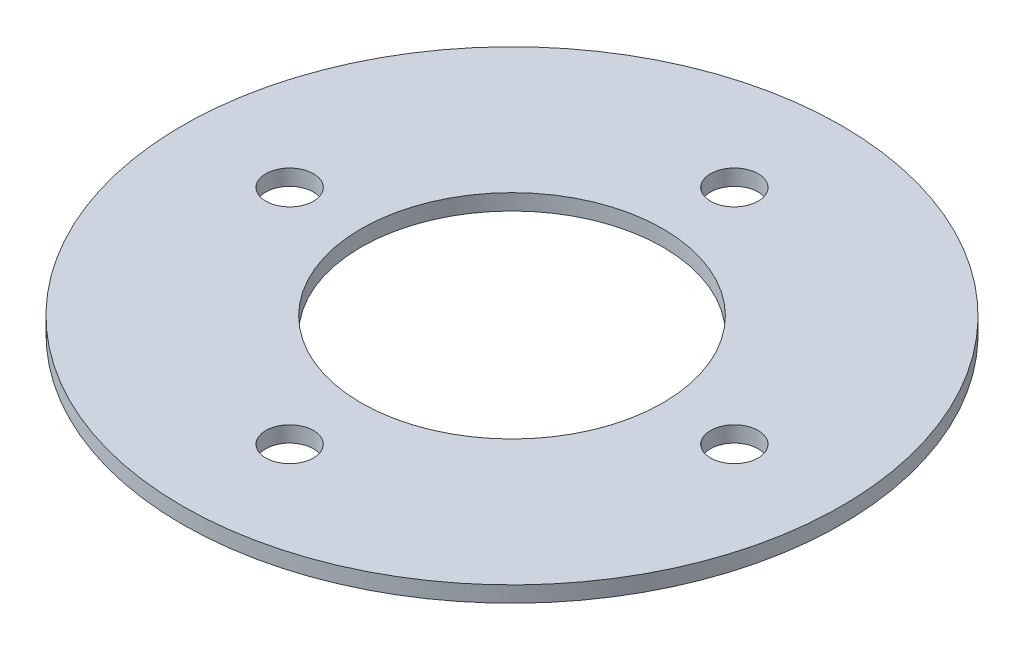
ISO-10303-21;
HEADER;
FILE_DESCRIPTION(('STEP AP214'),'2;1');
FILE_NAME('part.step','',(''),(''),'','','');
FILE_SCHEMA(('AUTOMOTIVE_DESIGN { 1 0 10303 214 1 1 1 1 }'));
ENDSEC;
DATA;
#1=APPLICATION_CONTEXT('core data for automotive mechanical design processes');
#2=APPLICATION_PROTOCOL_DEFINITION('international standard','automotive_design',2000,#1);
#3=PRODUCT_CONTEXT('',#1,'mechanical');
#4=PRODUCT('Part','Part','',(#3));
#5=PRODUCT_RELATED_PRODUCT_CATEGORY('part','',(#4));
#6=PRODUCT_DEFINITION_FORMATION('','',#4);
#7=PRODUCT_DEFINITION_CONTEXT('part definition',#1,'design');
#8=PRODUCT_DEFINITION('design','',#6,#7);
#9=PRODUCT_DEFINITION_SHAPE('','',#8);
#10=(LENGTH_UNIT() NAMED_UNIT(*) SI_UNIT(.MILLI.,.METRE.));
#11=(NAMED_UNIT(*) PLANE_ANGLE_UNIT() SI_UNIT($,.RADIAN.));
#12=(NAMED_UNIT(*) SI_UNIT($,.STERADIAN.) SOLID_ANGLE_UNIT());
#13=UNCERTAINTY_MEASURE_WITH_UNIT(LENGTH_MEASURE(1.E-05),#10,'distance_accuracy_value','');
#14=(GEOMETRIC_REPRESENTATION_CONTEXT(3) GLOBAL_UNCERTAINTY_ASSIGNED_CONTEXT((#13)) GLOBAL_UNIT_ASSIGNED_CONTEXT((#10,
#11,#12)) REPRESENTATION_CONTEXT('',''));
#15=CARTESIAN_POINT('',(0.,0.,0.));
#16=DIRECTION('',(0.,0.,1.));
#17=DIRECTION('',(1.,0.,0.));
#18=AXIS2_PLACEMENT_3D('',#15,#16,#17);
#19=CARTESIAN_POINT('',(0.,1.,0.));
#20=DIRECTION('',(0.,-1.,0.));
#21=DIRECTION('',(0.,0.,-1.));
#22=AXIS2_PLACEMENT_3D('',#19,#20,#21);
#23=CYLINDRICAL_SURFACE('',#22,9.5);
#24=CARTESIAN_POINT('',(0.,1.,0.));
#25=DIRECTION('',(0.,1.,0.));
#26=DIRECTION('',(0.,0.,1.));
#27=AXIS2_PLACEMENT_3D('',#24,#25,#26);
#28=CIRCLE('',#27,9.5);
#29=CARTESIAN_POINT('',(0.,1.,9.5));
#30=VERTEX_POINT('',#29);
#31=EDGE_CURVE('E47',#30,#30,#28,.T.);
#32=ORIENTED_EDGE('',*,*,#31,.T.);
#33=EDGE_LOOP('',(#32));
#34=FACE_BOUND('',#33,.T.);
#35=CARTESIAN_POINT('',(0.,0.,0.));
#36=DIRECTION('',(0.,1.,0.));
#37=DIRECTION('',(0.,0.,1.));
#38=AXIS2_PLACEMENT_3D('',#35,#36,#37);
#39=CIRCLE('',#38,9.5);
#40=CARTESIAN_POINT('',(0.,0.,9.5));
#41=VERTEX_POINT('',#40);
#42=EDGE_CURVE('E66',#41,#41,#39,.T.);
#43=ORIENTED_EDGE('',*,*,#42,.F.);
#44=EDGE_LOOP('',(#43));
#45=FACE_BOUND('',#44,.T.);
#46=ADVANCED_FACE('F41',(#34,#45),#23,.F.);
#47=CARTESIAN_POINT('',(14.,1.,0.));
#48=DIRECTION('',(0.,-1.,0.));
#49=DIRECTION('',(0.,0.,-1.));
#50=AXIS2_PLACEMENT_3D('',#47,#48,#49);
#51=CYLINDRICAL_SURFACE('',#50,1.5);
#52=CARTESIAN_POINT('',(14.,1.,0.));
#53=DIRECTION('',(0.,1.,0.));
#54=DIRECTION('',(0.,0.,1.));
#55=AXIS2_PLACEMENT_3D('',#52,#53,#54);
#56=CIRCLE('',#55,1.5);
#57=CARTESIAN_POINT('',(14.,1.,1.5));
#58=VERTEX_POINT('',#57);
#59=EDGE_CURVE('E53',#58,#58,#56,.T.);
#60=ORIENTED_EDGE('',*,*,#59,.T.);
#61=EDGE_LOOP('',(#60));
#62=FACE_BOUND('',#61,.T.);
#63=CARTESIAN_POINT('',(14.,0.,0.));
#64=DIRECTION('',(0.,1.,0.));
#65=DIRECTION('',(0.,0.,1.));
#66=AXIS2_PLACEMENT_3D('',#63,#64,#65);
#67=CIRCLE('',#66,1.5);
#68=CARTESIAN_POINT('',(14.,0.,1.5));
#69=VERTEX_POINT('',#68);
#70=EDGE_CURVE('E69',#69,#69,#67,.T.);
#71=ORIENTED_EDGE('',*,*,#70,.F.);
#72=EDGE_LOOP('',(#71));
#73=FACE_BOUND('',#72,.T.);
#74=ADVANCED_FACE('F89',(#62,#73),#51,.F.);
#75=CARTESIAN_POINT('',(0.,1.,14.));
#76=DIRECTION('',(0.,-1.,0.));
#77=DIRECTION('',(0.,0.,-1.));
#78=AXIS2_PLACEMENT_3D('',#75,#76,#77);
#79=CYLINDRICAL_SURFACE('',#78,1.5);
#80=CARTESIAN_POINT('',(0.,1.,14.));
#81=DIRECTION('',(0.,1.,0.));
#82=DIRECTION('',(0.,0.,1.));
#83=AXIS2_PLACEMENT_3D('',#80,#81,#82);
#84=CIRCLE('',#83,1.5);
#85=CARTESIAN_POINT('',(0.,1.,15.5));
#86=VERTEX_POINT('',#85);
#87=EDGE_CURVE('E85',#86,#86,#84,.T.);
#88=ORIENTED_EDGE('',*,*,#87,.T.);
#89=EDGE_LOOP('',(#88));
#90=FACE_BOUND('',#89,.T.);
#91=CARTESIAN_POINT('',(0.,0.,14.));
#92=DIRECTION('',(0.,1.,0.));
#93=DIRECTION('',(0.,0.,1.));
#94=AXIS2_PLACEMENT_3D('',#91,#92,#93);
#95=CIRCLE('',#94,1.5);
#96=CARTESIAN_POINT('',(0.,0.,15.5));
#97=VERTEX_POINT('',#96);
#98=EDGE_CURVE('E65',#97,#97,#95,.T.);
#99=ORIENTED_EDGE('',*,*,#98,.F.);
#100=EDGE_LOOP('',(#99));
#101=FACE_BOUND('',#100,.T.);
#102=ADVANCED_FACE('F107',(#90,#101),#79,.F.);
#103=CARTESIAN_POINT('',(-14.,1.,0.));
#104=DIRECTION('',(0.,-1.,0.));
#105=DIRECTION('',(0.,0.,-1.));
#106=AXIS2_PLACEMENT_3D('',#103,#104,#105);
#107=CYLINDRICAL_SURFACE('',#106,1.5);
#108=CARTESIAN_POINT('',(-14.,1.,0.));
#109=DIRECTION('',(0.,1.,0.));
#110=DIRECTION('',(0.,0.,1.));
#111=AXIS2_PLACEMENT_3D('',#108,#109,#110);
#112=CIRCLE('',#111,1.5);
#113=CARTESIAN_POINT('',(-14.,1.,1.5));
#114=VERTEX_POINT('',#113);
#115=EDGE_CURVE('E77',#114,#114,#112,.T.);
#116=ORIENTED_EDGE('',*,*,#115,.T.);
#117=EDGE_LOOP('',(#116));
#118=FACE_BOUND('',#117,.T.);
#119=CARTESIAN_POINT('',(-14.,0.,0.));
#120=DIRECTION('',(0.,1.,0.));
#121=DIRECTION('',(0.,0.,1.));
#122=AXIS2_PLACEMENT_3D('',#119,#120,#121);
#123=CIRCLE('',#122,1.5);
#124=CARTESIAN_POINT('',(-14.,0.,1.5));
#125=VERTEX_POINT('',#124);
#126=EDGE_CURVE('E63',#125,#125,#123,.T.);
#127=ORIENTED_EDGE('',*,*,#126,.F.);
#128=EDGE_LOOP('',(#127));
#129=FACE_BOUND('',#128,.T.);
#130=ADVANCED_FACE('F111',(#118,#129),#107,.F.);
#131=CARTESIAN_POINT('',(0.,1.,-14.));
#132=DIRECTION('',(0.,-1.,0.));
#133=DIRECTION('',(0.,0.,-1.));
#134=AXIS2_PLACEMENT_3D('',#131,#132,#133);
#135=CYLINDRICAL_SURFACE('',#134,1.5);
#136=CARTESIAN_POINT('',(0.,1.,-14.));
#137=DIRECTION('',(0.,1.,0.));
#138=DIRECTION('',(0.,0.,1.));
#139=AXIS2_PLACEMENT_3D('',#136,#137,#138);
#140=CIRCLE('',#139,1.5);
#141=CARTESIAN_POINT('',(0.,1.,-12.5));
#142=VERTEX_POINT('',#141);
#143=EDGE_CURVE('E74',#142,#142,#140,.T.);
#144=ORIENTED_EDGE('',*,*,#143,.T.);
#145=EDGE_LOOP('',(#144));
#146=FACE_BOUND('',#145,.T.);
#147=CARTESIAN_POINT('',(0.,0.,-14.));
#148=DIRECTION('',(0.,1.,0.));
#149=DIRECTION('',(0.,0.,1.));
#150=AXIS2_PLACEMENT_3D('',#147,#148,#149);
#151=CIRCLE('',#150,1.5);
#152=CARTESIAN_POINT('',(0.,0.,-12.5));
#153=VERTEX_POINT('',#152);
#154=EDGE_CURVE('E59',#153,#153,#151,.T.);
#155=ORIENTED_EDGE('',*,*,#154,.F.);
#156=EDGE_LOOP('',(#155));
#157=FACE_BOUND('',#156,.T.);
#158=ADVANCED_FACE('F43',(#146,#157),#135,.F.);
#159=CARTESIAN_POINT('',(0.,1.,0.));
#160=DIRECTION('',(0.,-1.,0.));
#161=DIRECTION('',(0.,0.,-1.));
#162=AXIS2_PLACEMENT_3D('',#159,#160,#161);
#163=CYLINDRICAL_SURFACE('',#162,20.75);
#164=CARTESIAN_POINT('',(0.,1.,0.));
#165=DIRECTION('',(0.,1.,0.));
#166=DIRECTION('',(0.,0.,1.));
#167=AXIS2_PLACEMENT_3D('',#164,#165,#166);
#168=CIRCLE('',#167,20.75);
#169=CARTESIAN_POINT('',(0.,1.,20.75));
#170=VERTEX_POINT('',#169);
#171=EDGE_CURVE('E10',#170,#170,#168,.T.);
#172=ORIENTED_EDGE('',*,*,#171,.F.);
#173=EDGE_LOOP('',(#172));
#174=FACE_BOUND('',#173,.T.);
#175=CARTESIAN_POINT('',(0.,0.,0.));
#176=DIRECTION('',(0.,1.,0.));
#177=DIRECTION('',(0.,0.,1.));
#178=AXIS2_PLACEMENT_3D('',#175,#176,#177);
#179=CIRCLE('',#178,20.75);
#180=CARTESIAN_POINT('',(0.,0.,20.75));
#181=VERTEX_POINT('',#180);
#182=EDGE_CURVE('E44',#181,#181,#179,.T.);
#183=ORIENTED_EDGE('',*,*,#182,.T.);
#184=EDGE_LOOP('',(#183));
#185=FACE_BOUND('',#184,.T.);
#186=ADVANCED_FACE('F100',(#174,#185),#163,.T.);
#187=CARTESIAN_POINT('',(0.,1.,0.));
#188=DIRECTION('',(0.,1.,0.));
#189=DIRECTION('',(0.,0.,1.));
#190=AXIS2_PLACEMENT_3D('',#187,#188,#189);
#191=PLANE('',#190);
#192=ORIENTED_EDGE('',*,*,#143,.F.);
#193=EDGE_LOOP('',(#192));
#194=FACE_BOUND('',#193,.T.);
#195=ORIENTED_EDGE('',*,*,#115,.F.);
#196=EDGE_LOOP('',(#195));
#197=FACE_BOUND('',#196,.T.);
#198=ORIENTED_EDGE('',*,*,#87,.F.);
#199=EDGE_LOOP('',(#198));
#200=FACE_BOUND('',#199,.T.);
#201=ORIENTED_EDGE('',*,*,#59,.F.);
#202=EDGE_LOOP('',(#201));
#203=FACE_BOUND('',#202,.T.);
#204=ORIENTED_EDGE('',*,*,#31,.F.);
#205=EDGE_LOOP('',(#204));
#206=FACE_BOUND('',#205,.T.);
#207=ORIENTED_EDGE('',*,*,#171,.T.);
#208=EDGE_LOOP('',(#207));
#209=FACE_BOUND('',#208,.T.);
#210=ADVANCED_FACE('F91',(#194,#197,#200,#203,#206,#209),#191,.T.);
#211=CARTESIAN_POINT('',(0.,0.,0.));
#212=DIRECTION('',(0.,1.,0.));
#213=DIRECTION('',(0.,0.,1.));
#214=AXIS2_PLACEMENT_3D('',#211,#212,#213);
#215=PLANE('',#214);
#216=ORIENTED_EDGE('',*,*,#154,.T.);
#217=EDGE_LOOP('',(#216));
#218=FACE_BOUND('',#217,.T.);
#219=ORIENTED_EDGE('',*,*,#126,.T.);
#220=EDGE_LOOP('',(#219));
#221=FACE_BOUND('',#220,.T.);
#222=ORIENTED_EDGE('',*,*,#98,.T.);
#223=EDGE_LOOP('',(#222));
#224=FACE_BOUND('',#223,.T.);
#225=ORIENTED_EDGE('',*,*,#70,.T.);
#226=EDGE_LOOP('',(#225));
#227=FACE_BOUND('',#226,.T.);
#228=ORIENTED_EDGE('',*,*,#42,.T.);
#229=EDGE_LOOP('',(#228));
#230=FACE_BOUND('',#229,.T.);
#231=ORIENTED_EDGE('',*,*,#182,.F.);
#232=EDGE_LOOP('',(#231));
#233=FACE_BOUND('',#232,.T.);
#234=ADVANCED_FACE('F96',(#218,#221,#224,#227,#230,#233),#215,.F.);
#235=CLOSED_SHELL('',(#46,#74,#102,#130,#158,#186,#210,#234));
#236=MANIFOLD_SOLID_BREP('B2',#235);
#237=ADVANCED_BREP_SHAPE_REPRESENTATION('',(#18,#236),#14);
#238=SHAPE_DEFINITION_REPRESENTATION(#9,#237);
ENDSEC;
END-ISO-10303-21;
